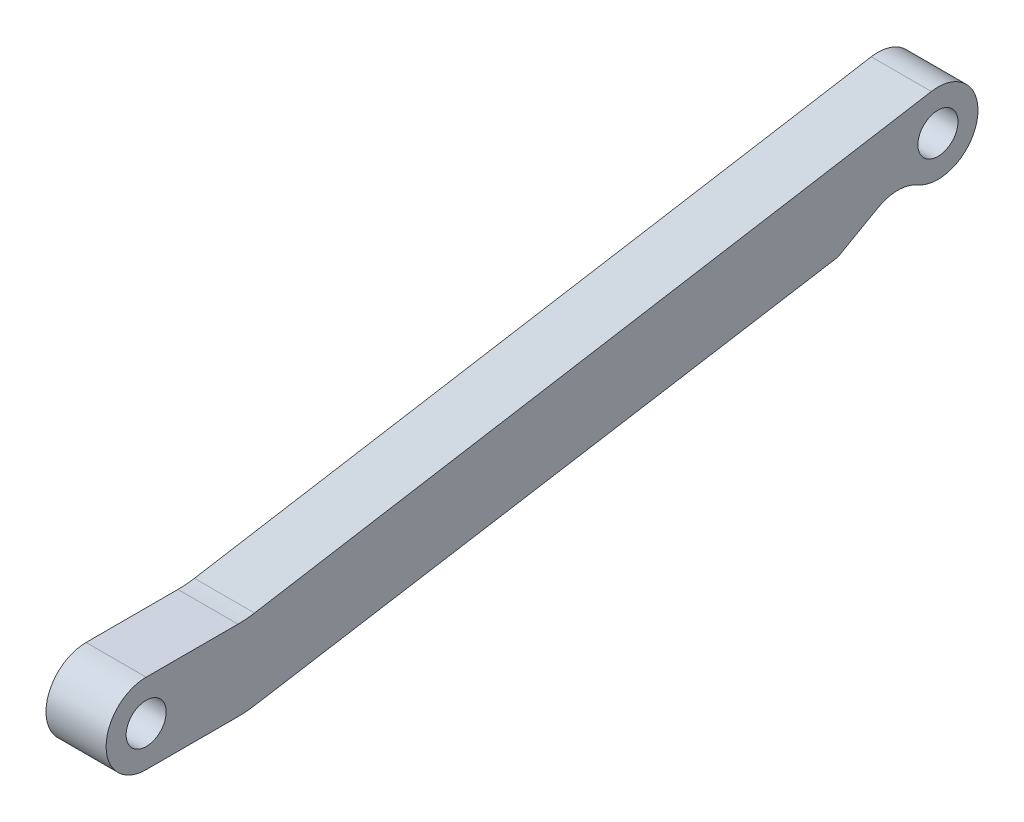
ISO-10303-21;
HEADER;
FILE_DESCRIPTION(('STEP AP214'),'2;1');
FILE_NAME('part.step','',(''),(''),'','','');
FILE_SCHEMA(('AUTOMOTIVE_DESIGN { 1 0 10303 214 1 1 1 1 }'));
ENDSEC;
DATA;
#1=APPLICATION_CONTEXT('core data for automotive mechanical design processes');
#2=APPLICATION_PROTOCOL_DEFINITION('international standard','automotive_design',2000,#1);
#3=PRODUCT_CONTEXT('',#1,'mechanical');
#4=PRODUCT('Part','Part','',(#3));
#5=PRODUCT_RELATED_PRODUCT_CATEGORY('part','',(#4));
#6=PRODUCT_DEFINITION_FORMATION('','',#4);
#7=PRODUCT_DEFINITION_CONTEXT('part definition',#1,'design');
#8=PRODUCT_DEFINITION('design','',#6,#7);
#9=PRODUCT_DEFINITION_SHAPE('','',#8);
#10=(LENGTH_UNIT() NAMED_UNIT(*) SI_UNIT(.MILLI.,.METRE.));
#11=(NAMED_UNIT(*) PLANE_ANGLE_UNIT() SI_UNIT($,.RADIAN.));
#12=(NAMED_UNIT(*) SI_UNIT($,.STERADIAN.) SOLID_ANGLE_UNIT());
#13=UNCERTAINTY_MEASURE_WITH_UNIT(LENGTH_MEASURE(1.E-05),#10,'distance_accuracy_value','');
#14=(GEOMETRIC_REPRESENTATION_CONTEXT(3) GLOBAL_UNCERTAINTY_ASSIGNED_CONTEXT((#13)) GLOBAL_UNIT_ASSIGNED_CONTEXT((#10,
#11,#12)) REPRESENTATION_CONTEXT('',''));
#15=CARTESIAN_POINT('',(0.,0.,0.));
#16=DIRECTION('',(0.,0.,1.));
#17=DIRECTION('',(1.,0.,0.));
#18=AXIS2_PLACEMENT_3D('',#15,#16,#17);
#19=CARTESIAN_POINT('',(-1.5,-1.71239706498406,-37.524508406473));
#20=DIRECTION('',(1.,0.,0.));
#21=DIRECTION('',(0.,0.,-1.));
#22=AXIS2_PLACEMENT_3D('',#19,#20,#21);
#23=CYLINDRICAL_SURFACE('',#22,2.);
#24=DIRECTION('',(1.,0.,0.));
#25=VECTOR('',#24,1.);
#26=CARTESIAN_POINT('',(-1.5,0.0188014675079667,-38.5259831396028));
#27=LINE('',#26,#25);
#28=CARTESIAN_POINT('',(-1.5,0.0188014675079667,-38.5259831396028));
#29=VERTEX_POINT('',#28);
#30=CARTESIAN_POINT('',(1.5,0.0188014675079667,-38.5259831396028));
#31=VERTEX_POINT('',#30);
#32=EDGE_CURVE('E43',#29,#31,#27,.T.);
#33=ORIENTED_EDGE('',*,*,#32,.T.);
#34=CARTESIAN_POINT('',(1.5,-1.71239706498406,-37.524508406473));
#35=DIRECTION('',(1.,0.,0.));
#36=DIRECTION('',(0.,0.,-1.));
#37=AXIS2_PLACEMENT_3D('',#34,#35,#36);
#38=CIRCLE('',#37,2.);
#39=CARTESIAN_POINT('',(1.5,0.0298442239393699,-36.5423702842262));
#40=VERTEX_POINT('',#39);
#41=EDGE_CURVE('E120',#31,#40,#38,.T.);
#42=ORIENTED_EDGE('',*,*,#41,.T.);
#43=DIRECTION('',(1.,0.,0.));
#44=VECTOR('',#43,1.);
#45=CARTESIAN_POINT('',(-1.5,0.0298442239393699,-36.5423702842262));
#46=LINE('',#45,#44);
#47=CARTESIAN_POINT('',(-1.5,0.0298442239393699,-36.5423702842262));
#48=VERTEX_POINT('',#47);
#49=EDGE_CURVE('E11',#48,#40,#46,.T.);
#50=ORIENTED_EDGE('',*,*,#49,.F.);
#51=CARTESIAN_POINT('',(-1.5,-1.71239706498406,-37.524508406473));
#52=DIRECTION('',(1.,0.,0.));
#53=DIRECTION('',(0.,0.,-1.));
#54=AXIS2_PLACEMENT_3D('',#51,#52,#53);
#55=CIRCLE('',#54,2.);
#56=EDGE_CURVE('E56',#29,#48,#55,.T.);
#57=ORIENTED_EDGE('',*,*,#56,.F.);
#58=EDGE_LOOP('',(#33,#42,#50,#57));
#59=FACE_BOUND('',#58,.T.);
#60=ADVANCED_FACE('F39',(#59),#23,.F.);
#61=CARTESIAN_POINT('',(-1.5,-15.609462343075,-8.79938280212735));
#62=DIRECTION('',(0.,-0.87112064446172,-0.491069061123379));
#63=DIRECTION('',(0.,0.491069061123379,-0.871120644461721));
#64=AXIS2_PLACEMENT_3D('',#61,#62,#63);
#65=PLANE('',#64);
#66=ORIENTED_EDGE('',*,*,#49,.T.);
#67=DIRECTION('',(0.,0.491069061123379,-0.871120644461721));
#68=VECTOR('',#67,1.);
#69=CARTESIAN_POINT('',(1.5,-15.609462343075,-8.79938280212735));
#70=LINE('',#69,#68);
#71=CARTESIAN_POINT('',(1.5,-1.1060043550705,-34.5274578727326));
#72=VERTEX_POINT('',#71);
#73=EDGE_CURVE('E137',#72,#40,#70,.T.);
#74=ORIENTED_EDGE('',*,*,#73,.F.);
#75=DIRECTION('',(1.,0.,0.));
#76=VECTOR('',#75,1.);
#77=CARTESIAN_POINT('',(-1.5,-1.1060043550705,-34.5274578727326));
#78=LINE('',#77,#76);
#79=CARTESIAN_POINT('',(-1.5,-1.1060043550705,-34.5274578727326));
#80=VERTEX_POINT('',#79);
#81=EDGE_CURVE('E48',#80,#72,#78,.T.);
#82=ORIENTED_EDGE('',*,*,#81,.F.);
#83=DIRECTION('',(0.,0.491069061123379,-0.871120644461721));
#84=VECTOR('',#83,1.);
#85=CARTESIAN_POINT('',(-1.5,-15.609462343075,-8.79938280212735));
#86=LINE('',#85,#84);
#87=EDGE_CURVE('E124',#80,#48,#86,.T.);
#88=ORIENTED_EDGE('',*,*,#87,.T.);
#89=EDGE_LOOP('',(#66,#74,#82,#88));
#90=FACE_BOUND('',#89,.T.);
#91=ADVANCED_FACE('F232',(#90),#65,.T.);
#92=CARTESIAN_POINT('',(-1.5,-6.64614300120225,-1.10155757544909));
#93=DIRECTION('',(0.,-0.986541152083163,-0.163513165361157));
#94=DIRECTION('',(0.,0.163513165361157,-0.986541152083163));
#95=AXIS2_PLACEMENT_3D('',#92,#93,#94);
#96=PLANE('',#95);
#97=ORIENTED_EDGE('',*,*,#81,.T.);
#98=DIRECTION('',(0.,0.163513165361157,-0.986541152083163));
#99=VECTOR('',#98,1.);
#100=CARTESIAN_POINT('',(1.5,-6.64614300120225,-1.10155757544909));
#101=LINE('',#100,#99);
#102=CARTESIAN_POINT('',(1.5,-5.93270576041582,-5.40601340265965));
#103=VERTEX_POINT('',#102);
#104=EDGE_CURVE('E161',#103,#72,#101,.T.);
#105=ORIENTED_EDGE('',*,*,#104,.F.);
#106=DIRECTION('',(1.,0.,0.));
#107=VECTOR('',#106,1.);
#108=CARTESIAN_POINT('',(-1.5,-5.93270576041582,-5.40601340265965));
#109=LINE('',#108,#107);
#110=CARTESIAN_POINT('',(-1.5,-5.93270576041582,-5.40601340265965));
#111=VERTEX_POINT('',#110);
#112=EDGE_CURVE('E192',#111,#103,#109,.T.);
#113=ORIENTED_EDGE('',*,*,#112,.F.);
#114=DIRECTION('',(0.,0.163513165361157,-0.986541152083163));
#115=VECTOR('',#114,1.);
#116=CARTESIAN_POINT('',(-1.5,-6.64614300120225,-1.10155757544909));
#117=LINE('',#116,#115);
#118=EDGE_CURVE('E188',#111,#80,#117,.T.);
#119=ORIENTED_EDGE('',*,*,#118,.T.);
#120=EDGE_LOOP('',(#97,#105,#113,#119));
#121=FACE_BOUND('',#120,.T.);
#122=ADVANCED_FACE('F230',(#121),#96,.T.);
#123=CARTESIAN_POINT('',(-1.5,-1.,-4.58844757585387));
#124=DIRECTION('',(1.,0.,0.));
#125=DIRECTION('',(0.,0.,-1.));
#126=AXIS2_PLACEMENT_3D('',#123,#124,#125);
#127=CYLINDRICAL_SURFACE('',#126,5.);
#128=ORIENTED_EDGE('',*,*,#112,.T.);
#129=CARTESIAN_POINT('',(1.5,-1.,-4.58844757585387));
#130=DIRECTION('',(1.,0.,0.));
#131=DIRECTION('',(0.,0.,-1.));
#132=AXIS2_PLACEMENT_3D('',#129,#130,#131);
#133=CIRCLE('',#132,5.);
#134=CARTESIAN_POINT('',(1.5,-6.,-4.58844757585387));
#135=VERTEX_POINT('',#134);
#136=EDGE_CURVE('E158',#135,#103,#133,.T.);
#137=ORIENTED_EDGE('',*,*,#136,.F.);
#138=DIRECTION('',(1.,0.,0.));
#139=VECTOR('',#138,1.);
#140=CARTESIAN_POINT('',(-1.5,-6.,-4.58844757585387));
#141=LINE('',#140,#139);
#142=CARTESIAN_POINT('',(-1.5,-6.,-4.58844757585387));
#143=VERTEX_POINT('',#142);
#144=EDGE_CURVE('E194',#143,#135,#141,.T.);
#145=ORIENTED_EDGE('',*,*,#144,.F.);
#146=CARTESIAN_POINT('',(-1.5,-1.,-4.58844757585387));
#147=DIRECTION('',(1.,0.,0.));
#148=DIRECTION('',(0.,0.,-1.));
#149=AXIS2_PLACEMENT_3D('',#146,#147,#148);
#150=CIRCLE('',#149,5.);
#151=EDGE_CURVE('E185',#143,#111,#150,.T.);
#152=ORIENTED_EDGE('',*,*,#151,.T.);
#153=EDGE_LOOP('',(#128,#137,#145,#152));
#154=FACE_BOUND('',#153,.T.);
#155=ADVANCED_FACE('F227',(#154),#127,.T.);
#156=CARTESIAN_POINT('',(-1.5,-6.,0.));
#157=DIRECTION('',(0.,-1.,0.));
#158=DIRECTION('',(0.,0.,-1.));
#159=AXIS2_PLACEMENT_3D('',#156,#157,#158);
#160=PLANE('',#159);
#161=ORIENTED_EDGE('',*,*,#144,.T.);
#162=DIRECTION('',(0.,0.,-1.));
#163=VECTOR('',#162,1.);
#164=CARTESIAN_POINT('',(1.5,-6.,0.));
#165=LINE('',#164,#163);
#166=CARTESIAN_POINT('',(1.5,-6.,0.));
#167=VERTEX_POINT('',#166);
#168=EDGE_CURVE('E155',#167,#135,#165,.T.);
#169=ORIENTED_EDGE('',*,*,#168,.F.);
#170=DIRECTION('',(1.,0.,0.));
#171=VECTOR('',#170,1.);
#172=CARTESIAN_POINT('',(-1.5,-6.,0.));
#173=LINE('',#172,#171);
#174=CARTESIAN_POINT('',(-1.5,-6.,0.));
#175=VERTEX_POINT('',#174);
#176=EDGE_CURVE('E196',#175,#167,#173,.T.);
#177=ORIENTED_EDGE('',*,*,#176,.F.);
#178=DIRECTION('',(0.,0.,-1.));
#179=VECTOR('',#178,1.);
#180=CARTESIAN_POINT('',(-1.5,-6.,0.));
#181=LINE('',#180,#179);
#182=EDGE_CURVE('E182',#175,#143,#181,.T.);
#183=ORIENTED_EDGE('',*,*,#182,.T.);
#184=EDGE_LOOP('',(#161,#169,#177,#183));
#185=FACE_BOUND('',#184,.T.);
#186=ADVANCED_FACE('F223',(#185),#160,.T.);
#187=CARTESIAN_POINT('',(-1.5,-4.,0.));
#188=DIRECTION('',(1.,0.,0.));
#189=DIRECTION('',(0.,0.,-1.));
#190=AXIS2_PLACEMENT_3D('',#187,#188,#189);
#191=CYLINDRICAL_SURFACE('',#190,2.);
#192=ORIENTED_EDGE('',*,*,#176,.T.);
#193=CARTESIAN_POINT('',(1.5,-4.,0.));
#194=DIRECTION('',(1.,0.,0.));
#195=DIRECTION('',(0.,0.,-1.));
#196=AXIS2_PLACEMENT_3D('',#193,#194,#195);
#197=CIRCLE('',#196,2.);
#198=CARTESIAN_POINT('',(1.5,-2.,0.));
#199=VERTEX_POINT('',#198);
#200=EDGE_CURVE('E152',#199,#167,#197,.T.);
#201=ORIENTED_EDGE('',*,*,#200,.F.);
#202=DIRECTION('',(1.,0.,0.));
#203=VECTOR('',#202,1.);
#204=CARTESIAN_POINT('',(-1.5,-2.,0.));
#205=LINE('',#204,#203);
#206=CARTESIAN_POINT('',(-1.5,-2.,0.));
#207=VERTEX_POINT('',#206);
#208=EDGE_CURVE('E198',#207,#199,#205,.T.);
#209=ORIENTED_EDGE('',*,*,#208,.F.);
#210=CARTESIAN_POINT('',(-1.5,-4.,0.));
#211=DIRECTION('',(1.,0.,0.));
#212=DIRECTION('',(0.,0.,-1.));
#213=AXIS2_PLACEMENT_3D('',#210,#211,#212);
#214=CIRCLE('',#213,2.);
#215=EDGE_CURVE('E179',#207,#175,#214,.T.);
#216=ORIENTED_EDGE('',*,*,#215,.T.);
#217=EDGE_LOOP('',(#192,#201,#209,#216));
#218=FACE_BOUND('',#217,.T.);
#219=ADVANCED_FACE('F220',(#218),#191,.T.);
#220=CARTESIAN_POINT('',(-1.5,-2.,0.));
#221=DIRECTION('',(0.,-1.,0.));
#222=DIRECTION('',(0.,0.,-1.));
#223=AXIS2_PLACEMENT_3D('',#220,#221,#222);
#224=PLANE('',#223);
#225=ORIENTED_EDGE('',*,*,#208,.T.);
#226=DIRECTION('',(0.,0.,-1.));
#227=VECTOR('',#226,1.);
#228=CARTESIAN_POINT('',(1.5,-2.,0.));
#229=LINE('',#228,#227);
#230=CARTESIAN_POINT('',(1.5,-2.,-4.58453953493418));
#231=VERTEX_POINT('',#230);
#232=EDGE_CURVE('E149',#199,#231,#229,.T.);
#233=ORIENTED_EDGE('',*,*,#232,.T.);
#234=DIRECTION('',(1.,0.,0.));
#235=VECTOR('',#234,1.);
#236=CARTESIAN_POINT('',(-1.5,-2.,-4.58453953493418));
#237=LINE('',#236,#235);
#238=CARTESIAN_POINT('',(-1.5,-2.,-4.58453953493418));
#239=VERTEX_POINT('',#238);
#240=EDGE_CURVE('E200',#239,#231,#237,.T.);
#241=ORIENTED_EDGE('',*,*,#240,.F.);
#242=DIRECTION('',(0.,0.,-1.));
#243=VECTOR('',#242,1.);
#244=CARTESIAN_POINT('',(-1.5,-2.,0.));
#245=LINE('',#244,#243);
#246=EDGE_CURVE('E177',#207,#239,#245,.T.);
#247=ORIENTED_EDGE('',*,*,#246,.F.);
#248=EDGE_LOOP('',(#225,#233,#241,#247));
#249=FACE_BOUND('',#248,.T.);
#250=ADVANCED_FACE('F215',(#249),#224,.F.);
#251=CARTESIAN_POINT('',(-1.5,3.,-4.58453953493418));
#252=DIRECTION('',(1.,0.,0.));
#253=DIRECTION('',(0.,0.,-1.));
#254=AXIS2_PLACEMENT_3D('',#251,#252,#253);
#255=CYLINDRICAL_SURFACE('',#254,5.);
#256=ORIENTED_EDGE('',*,*,#240,.T.);
#257=CARTESIAN_POINT('',(1.5,3.,-4.58453953493418));
#258=DIRECTION('',(1.,0.,0.));
#259=DIRECTION('',(0.,0.,-1.));
#260=AXIS2_PLACEMENT_3D('',#257,#258,#259);
#261=CIRCLE('',#260,5.);
#262=CARTESIAN_POINT('',(1.5,-1.93143046514675,-5.40976287889783));
#263=VERTEX_POINT('',#262);
#264=EDGE_CURVE('E146',#231,#263,#261,.T.);
#265=ORIENTED_EDGE('',*,*,#264,.T.);
#266=DIRECTION('',(1.,0.,0.));
#267=VECTOR('',#266,1.);
#268=CARTESIAN_POINT('',(-1.5,-1.93143046514675,-5.40976287889783));
#269=LINE('',#268,#267);
#270=CARTESIAN_POINT('',(-1.5,-1.93143046514675,-5.40976287889783));
#271=VERTEX_POINT('',#270);
#272=EDGE_CURVE('E202',#271,#263,#269,.T.);
#273=ORIENTED_EDGE('',*,*,#272,.F.);
#274=CARTESIAN_POINT('',(-1.5,3.,-4.58453953493418));
#275=DIRECTION('',(1.,0.,0.));
#276=DIRECTION('',(0.,0.,-1.));
#277=AXIS2_PLACEMENT_3D('',#274,#275,#276);
#278=CIRCLE('',#277,5.);
#279=EDGE_CURVE('E175',#239,#271,#278,.T.);
#280=ORIENTED_EDGE('',*,*,#279,.F.);
#281=EDGE_LOOP('',(#256,#265,#273,#280));
#282=FACE_BOUND('',#281,.T.);
#283=ADVANCED_FACE('F211',(#282),#255,.F.);
#284=CARTESIAN_POINT('',(-1.5,-2.75942682240071,-0.461761236602314));
#285=DIRECTION('',(0.,-0.986286093029349,-0.165044668792729));
#286=DIRECTION('',(0.,0.165044668792729,-0.98628609302935));
#287=AXIS2_PLACEMENT_3D('',#284,#285,#286);
#288=PLANE('',#287);
#289=ORIENTED_EDGE('',*,*,#272,.T.);
#290=DIRECTION('',(0.,0.165044668792729,-0.986286093029349));
#291=VECTOR('',#290,1.);
#292=CARTESIAN_POINT('',(1.5,-2.75942682240071,-0.461761236602314));
#293=LINE('',#292,#291);
#294=CARTESIAN_POINT('',(1.5,3.7225721860587,-39.1973685351472));
#295=VERTEX_POINT('',#294);
#296=EDGE_CURVE('E132',#263,#295,#293,.T.);
#297=ORIENTED_EDGE('',*,*,#296,.T.);
#298=DIRECTION('',(1.,0.,0.));
#299=VECTOR('',#298,1.);
#300=CARTESIAN_POINT('',(-1.5,3.7225721860587,-39.1973685351472));
#301=LINE('',#300,#299);
#302=CARTESIAN_POINT('',(-1.5,3.7225721860587,-39.1973685351472));
#303=VERTEX_POINT('',#302);
#304=EDGE_CURVE('E123',#303,#295,#301,.T.);
#305=ORIENTED_EDGE('',*,*,#304,.F.);
#306=DIRECTION('',(0.,0.165044668792729,-0.986286093029349));
#307=VECTOR('',#306,1.);
#308=CARTESIAN_POINT('',(-1.5,-2.75942682240071,-0.461761236602314));
#309=LINE('',#308,#307);
#310=EDGE_CURVE('E173',#271,#303,#309,.T.);
#311=ORIENTED_EDGE('',*,*,#310,.F.);
#312=EDGE_LOOP('',(#289,#297,#305,#311));
#313=FACE_BOUND('',#312,.T.);
#314=ADVANCED_FACE('F206',(#313),#288,.F.);
#315=CARTESIAN_POINT('',(-1.5,1.75,-39.5274578727326));
#316=DIRECTION('',(1.,0.,0.));
#317=DIRECTION('',(0.,0.,-1.));
#318=AXIS2_PLACEMENT_3D('',#315,#316,#317);
#319=CYLINDRICAL_SURFACE('',#318,0.999999999999998);
#320=CARTESIAN_POINT('',(-1.5,1.75,-39.5274578727326));
#321=DIRECTION('',(1.,0.,0.));
#322=DIRECTION('',(0.,0.,-1.));
#323=AXIS2_PLACEMENT_3D('',#320,#321,#322);
#324=CIRCLE('',#323,0.999999999999998);
#325=CARTESIAN_POINT('',(-1.5,1.75,-40.5274578727326));
#326=VERTEX_POINT('',#325);
#327=EDGE_CURVE('E167',#326,#326,#324,.T.);
#328=ORIENTED_EDGE('',*,*,#327,.F.);
#329=EDGE_LOOP('',(#328));
#330=FACE_BOUND('',#329,.T.);
#331=CARTESIAN_POINT('',(1.5,1.75,-39.5274578727326));
#332=DIRECTION('',(1.,0.,0.));
#333=DIRECTION('',(0.,0.,-1.));
#334=AXIS2_PLACEMENT_3D('',#331,#332,#333);
#335=CIRCLE('',#334,0.999999999999998);
#336=CARTESIAN_POINT('',(1.5,1.75,-40.5274578727326));
#337=VERTEX_POINT('',#336);
#338=EDGE_CURVE('E138',#337,#337,#335,.T.);
#339=ORIENTED_EDGE('',*,*,#338,.T.);
#340=EDGE_LOOP('',(#339));
#341=FACE_BOUND('',#340,.T.);
#342=ADVANCED_FACE('F252',(#330,#341),#319,.F.);
#343=CARTESIAN_POINT('',(-1.5,-4.,0.));
#344=DIRECTION('',(1.,0.,0.));
#345=DIRECTION('',(0.,0.,-1.));
#346=AXIS2_PLACEMENT_3D('',#343,#344,#345);
#347=CYLINDRICAL_SURFACE('',#346,1.);
#348=CARTESIAN_POINT('',(-1.5,-4.,0.));
#349=DIRECTION('',(1.,0.,0.));
#350=DIRECTION('',(0.,0.,-1.));
#351=AXIS2_PLACEMENT_3D('',#348,#349,#350);
#352=CIRCLE('',#351,1.);
#353=CARTESIAN_POINT('',(-1.5,-4.,-0.999999999999951));
#354=VERTEX_POINT('',#353);
#355=EDGE_CURVE('E164',#354,#354,#352,.T.);
#356=ORIENTED_EDGE('',*,*,#355,.F.);
#357=EDGE_LOOP('',(#356));
#358=FACE_BOUND('',#357,.T.);
#359=CARTESIAN_POINT('',(1.5,-4.,0.));
#360=DIRECTION('',(1.,0.,0.));
#361=DIRECTION('',(0.,0.,-1.));
#362=AXIS2_PLACEMENT_3D('',#359,#360,#361);
#363=CIRCLE('',#362,1.);
#364=CARTESIAN_POINT('',(1.5,-4.,-0.999999999999951));
#365=VERTEX_POINT('',#364);
#366=EDGE_CURVE('E141',#365,#365,#363,.T.);
#367=ORIENTED_EDGE('',*,*,#366,.T.);
#368=EDGE_LOOP('',(#367));
#369=FACE_BOUND('',#368,.T.);
#370=ADVANCED_FACE('F41',(#358,#369),#347,.F.);
#371=CARTESIAN_POINT('',(-1.5,1.75,-39.5274578727326));
#372=DIRECTION('',(1.,0.,0.));
#373=DIRECTION('',(0.,0.,-1.));
#374=AXIS2_PLACEMENT_3D('',#371,#372,#373);
#375=CYLINDRICAL_SURFACE('',#374,2.);
#376=ORIENTED_EDGE('',*,*,#304,.T.);
#377=CARTESIAN_POINT('',(1.5,1.75,-39.5274578727326));
#378=DIRECTION('',(1.,0.,0.));
#379=DIRECTION('',(0.,0.,-1.));
#380=AXIS2_PLACEMENT_3D('',#377,#378,#379);
#381=CIRCLE('',#380,2.);
#382=EDGE_CURVE('E126',#31,#295,#381,.T.);
#383=ORIENTED_EDGE('',*,*,#382,.F.);
#384=ORIENTED_EDGE('',*,*,#32,.F.);
#385=CARTESIAN_POINT('',(-1.5,1.75,-39.5274578727326));
#386=DIRECTION('',(1.,0.,0.));
#387=DIRECTION('',(0.,0.,-1.));
#388=AXIS2_PLACEMENT_3D('',#385,#386,#387);
#389=CIRCLE('',#388,2.);
#390=EDGE_CURVE('E171',#29,#303,#389,.T.);
#391=ORIENTED_EDGE('',*,*,#390,.T.);
#392=EDGE_LOOP('',(#376,#383,#384,#391));
#393=FACE_BOUND('',#392,.T.);
#394=ADVANCED_FACE('F127',(#393),#375,.T.);
#395=CARTESIAN_POINT('',(-1.5,0.,0.));
#396=DIRECTION('',(1.,0.,0.));
#397=DIRECTION('',(0.,0.,-1.));
#398=AXIS2_PLACEMENT_3D('',#395,#396,#397);
#399=PLANE('',#398);
#400=ORIENTED_EDGE('',*,*,#355,.T.);
#401=EDGE_LOOP('',(#400));
#402=FACE_BOUND('',#401,.T.);
#403=ORIENTED_EDGE('',*,*,#327,.T.);
#404=EDGE_LOOP('',(#403));
#405=FACE_BOUND('',#404,.T.);
#406=ORIENTED_EDGE('',*,*,#56,.T.);
#407=ORIENTED_EDGE('',*,*,#87,.F.);
#408=ORIENTED_EDGE('',*,*,#118,.F.);
#409=ORIENTED_EDGE('',*,*,#151,.F.);
#410=ORIENTED_EDGE('',*,*,#182,.F.);
#411=ORIENTED_EDGE('',*,*,#215,.F.);
#412=ORIENTED_EDGE('',*,*,#246,.T.);
#413=ORIENTED_EDGE('',*,*,#279,.T.);
#414=ORIENTED_EDGE('',*,*,#310,.T.);
#415=ORIENTED_EDGE('',*,*,#390,.F.);
#416=EDGE_LOOP('',(#406,#407,#408,#409,#410,#411,#412,#413,#414,#415));
#417=FACE_BOUND('',#416,.T.);
#418=ADVANCED_FACE('F233',(#402,#405,#417),#399,.F.);
#419=CARTESIAN_POINT('',(1.5,0.,0.));
#420=DIRECTION('',(1.,0.,0.));
#421=DIRECTION('',(0.,0.,-1.));
#422=AXIS2_PLACEMENT_3D('',#419,#420,#421);
#423=PLANE('',#422);
#424=ORIENTED_EDGE('',*,*,#366,.F.);
#425=EDGE_LOOP('',(#424));
#426=FACE_BOUND('',#425,.T.);
#427=ORIENTED_EDGE('',*,*,#338,.F.);
#428=EDGE_LOOP('',(#427));
#429=FACE_BOUND('',#428,.T.);
#430=ORIENTED_EDGE('',*,*,#41,.F.);
#431=ORIENTED_EDGE('',*,*,#382,.T.);
#432=ORIENTED_EDGE('',*,*,#296,.F.);
#433=ORIENTED_EDGE('',*,*,#264,.F.);
#434=ORIENTED_EDGE('',*,*,#232,.F.);
#435=ORIENTED_EDGE('',*,*,#200,.T.);
#436=ORIENTED_EDGE('',*,*,#168,.T.);
#437=ORIENTED_EDGE('',*,*,#136,.T.);
#438=ORIENTED_EDGE('',*,*,#104,.T.);
#439=ORIENTED_EDGE('',*,*,#73,.T.);
#440=EDGE_LOOP('',(#430,#431,#432,#433,#434,#435,#436,#437,#438,#439));
#441=FACE_BOUND('',#440,.T.);
#442=ADVANCED_FACE('F135',(#426,#429,#441),#423,.T.);
#443=CLOSED_SHELL('',(#60,#91,#122,#155,#186,#219,#250,#283,#314,#342,#370,#394,#418,#442));
#444=MANIFOLD_SOLID_BREP('B2',#443);
#445=ADVANCED_BREP_SHAPE_REPRESENTATION('',(#18,#444),#14);
#446=SHAPE_DEFINITION_REPRESENTATION(#9,#445);
ENDSEC;
END-ISO-10303-21;
